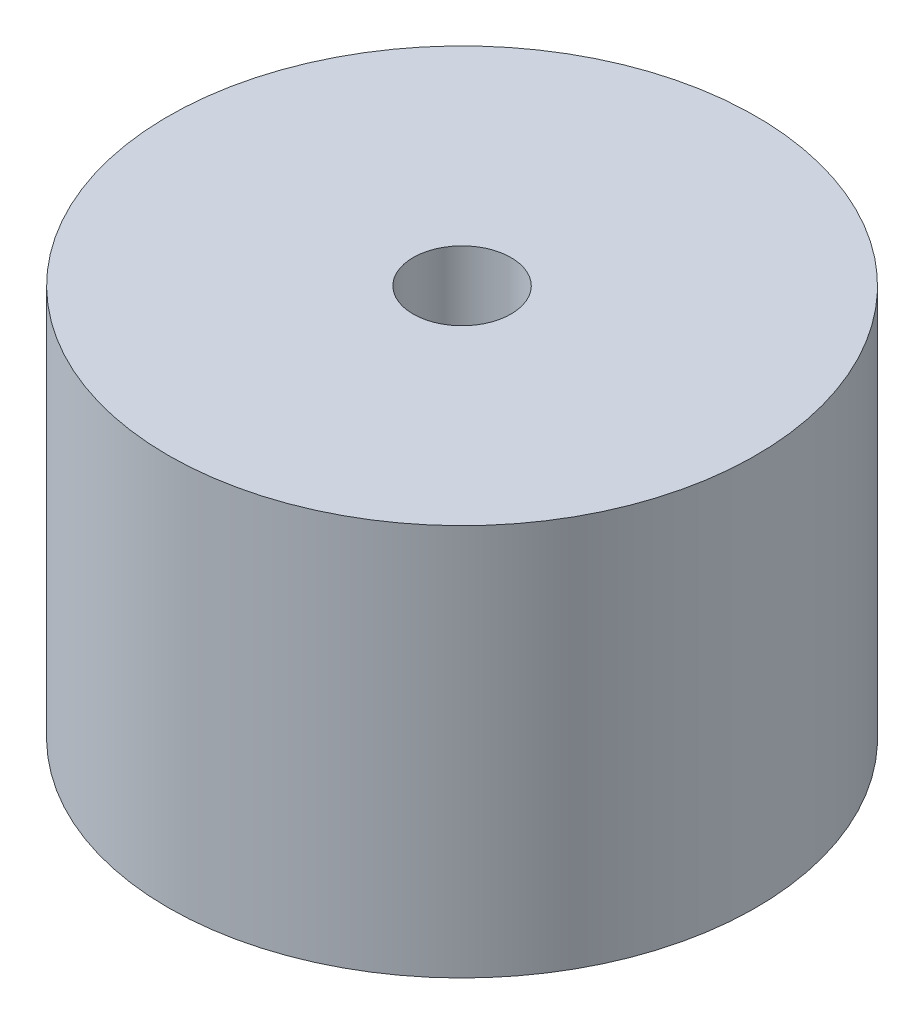
ISO-10303-21;
HEADER;
FILE_DESCRIPTION(('STEP AP214'),'2;1');
FILE_NAME('part.step','',(''),(''),'','','');
FILE_SCHEMA(('AUTOMOTIVE_DESIGN { 1 0 10303 214 1 1 1 1 }'));
ENDSEC;
DATA;
#1=APPLICATION_CONTEXT('core data for automotive mechanical design processes');
#2=APPLICATION_PROTOCOL_DEFINITION('international standard','automotive_design',2000,#1);
#3=PRODUCT_CONTEXT('',#1,'mechanical');
#4=PRODUCT('Part','Part','',(#3));
#5=PRODUCT_RELATED_PRODUCT_CATEGORY('part','',(#4));
#6=PRODUCT_DEFINITION_FORMATION('','',#4);
#7=PRODUCT_DEFINITION_CONTEXT('part definition',#1,'design');
#8=PRODUCT_DEFINITION('design','',#6,#7);
#9=PRODUCT_DEFINITION_SHAPE('','',#8);
#10=(LENGTH_UNIT() NAMED_UNIT(*) SI_UNIT(.MILLI.,.METRE.));
#11=(NAMED_UNIT(*) PLANE_ANGLE_UNIT() SI_UNIT($,.RADIAN.));
#12=(NAMED_UNIT(*) SI_UNIT($,.STERADIAN.) SOLID_ANGLE_UNIT());
#13=UNCERTAINTY_MEASURE_WITH_UNIT(LENGTH_MEASURE(1.E-05),#10,'distance_accuracy_value','');
#14=(GEOMETRIC_REPRESENTATION_CONTEXT(3) GLOBAL_UNCERTAINTY_ASSIGNED_CONTEXT((#13)) GLOBAL_UNIT_ASSIGNED_CONTEXT((#10,
#11,#12)) REPRESENTATION_CONTEXT('',''));
#15=CARTESIAN_POINT('',(0.,0.,0.));
#16=DIRECTION('',(0.,0.,1.));
#17=DIRECTION('',(1.,0.,0.));
#18=AXIS2_PLACEMENT_3D('',#15,#16,#17);
#19=CARTESIAN_POINT('',(0.,12.,0.));
#20=DIRECTION('',(0.,1.,0.));
#21=DIRECTION('',(0.,0.,1.));
#22=AXIS2_PLACEMENT_3D('',#19,#20,#21);
#23=PLANE('',#22);
#24=CARTESIAN_POINT('',(0.,12.,0.));
#25=DIRECTION('',(0.,1.,0.));
#26=DIRECTION('',(0.,0.,1.));
#27=AXIS2_PLACEMENT_3D('',#24,#25,#26);
#28=CIRCLE('',#27,9.);
#29=CARTESIAN_POINT('',(0.,12.,9.));
#30=VERTEX_POINT('',#29);
#31=EDGE_CURVE('E11',#30,#30,#28,.T.);
#32=ORIENTED_EDGE('',*,*,#31,.T.);
#33=EDGE_LOOP('',(#32));
#34=FACE_BOUND('',#33,.T.);
#35=CARTESIAN_POINT('',(0.,12.,0.));
#36=DIRECTION('',(0.,1.,0.));
#37=DIRECTION('',(0.,0.,1.));
#38=AXIS2_PLACEMENT_3D('',#35,#36,#37);
#39=CIRCLE('',#38,1.5);
#40=CARTESIAN_POINT('',(0.,12.,1.5));
#41=VERTEX_POINT('',#40);
#42=EDGE_CURVE('E42',#41,#41,#39,.T.);
#43=ORIENTED_EDGE('',*,*,#42,.F.);
#44=EDGE_LOOP('',(#43));
#45=FACE_BOUND('',#44,.T.);
#46=ADVANCED_FACE('F31',(#34,#45),#23,.T.);
#47=CARTESIAN_POINT('',(0.,0.,0.));
#48=DIRECTION('',(0.,1.,0.));
#49=DIRECTION('',(0.,0.,1.));
#50=AXIS2_PLACEMENT_3D('',#47,#48,#49);
#51=PLANE('',#50);
#52=CARTESIAN_POINT('',(0.,0.,0.));
#53=DIRECTION('',(0.,1.,0.));
#54=DIRECTION('',(0.,0.,1.));
#55=AXIS2_PLACEMENT_3D('',#52,#53,#54);
#56=CIRCLE('',#55,9.);
#57=CARTESIAN_POINT('',(0.,0.,9.));
#58=VERTEX_POINT('',#57);
#59=EDGE_CURVE('E35',#58,#58,#56,.T.);
#60=ORIENTED_EDGE('',*,*,#59,.F.);
#61=EDGE_LOOP('',(#60));
#62=FACE_BOUND('',#61,.T.);
#63=CARTESIAN_POINT('',(0.,0.,0.));
#64=DIRECTION('',(0.,1.,0.));
#65=DIRECTION('',(0.,0.,1.));
#66=AXIS2_PLACEMENT_3D('',#63,#64,#65);
#67=CIRCLE('',#66,1.5);
#68=CARTESIAN_POINT('',(0.,0.,1.5));
#69=VERTEX_POINT('',#68);
#70=EDGE_CURVE('E44',#69,#69,#67,.T.);
#71=ORIENTED_EDGE('',*,*,#70,.T.);
#72=EDGE_LOOP('',(#71));
#73=FACE_BOUND('',#72,.T.);
#74=ADVANCED_FACE('F57',(#62,#73),#51,.F.);
#75=CARTESIAN_POINT('',(0.,12.,0.));
#76=DIRECTION('',(0.,-1.,0.));
#77=DIRECTION('',(0.,0.,-1.));
#78=AXIS2_PLACEMENT_3D('',#75,#76,#77);
#79=CYLINDRICAL_SURFACE('',#78,9.);
#80=ORIENTED_EDGE('',*,*,#31,.F.);
#81=EDGE_LOOP('',(#80));
#82=FACE_BOUND('',#81,.T.);
#83=ORIENTED_EDGE('',*,*,#59,.T.);
#84=EDGE_LOOP('',(#83));
#85=FACE_BOUND('',#84,.T.);
#86=ADVANCED_FACE('F33',(#82,#85),#79,.T.);
#87=CARTESIAN_POINT('',(0.,12.,0.));
#88=DIRECTION('',(0.,-1.,0.));
#89=DIRECTION('',(0.,0.,-1.));
#90=AXIS2_PLACEMENT_3D('',#87,#88,#89);
#91=CYLINDRICAL_SURFACE('',#90,1.5);
#92=ORIENTED_EDGE('',*,*,#42,.T.);
#93=EDGE_LOOP('',(#92));
#94=FACE_BOUND('',#93,.T.);
#95=ORIENTED_EDGE('',*,*,#70,.F.);
#96=EDGE_LOOP('',(#95));
#97=FACE_BOUND('',#96,.T.);
#98=ADVANCED_FACE('F53',(#94,#97),#91,.F.);
#99=CLOSED_SHELL('',(#46,#74,#86,#98));
#100=MANIFOLD_SOLID_BREP('B2',#99);
#101=ADVANCED_BREP_SHAPE_REPRESENTATION('',(#18,#100),#14);
#102=SHAPE_DEFINITION_REPRESENTATION(#9,#101);
ENDSEC;
END-ISO-10303-21;
